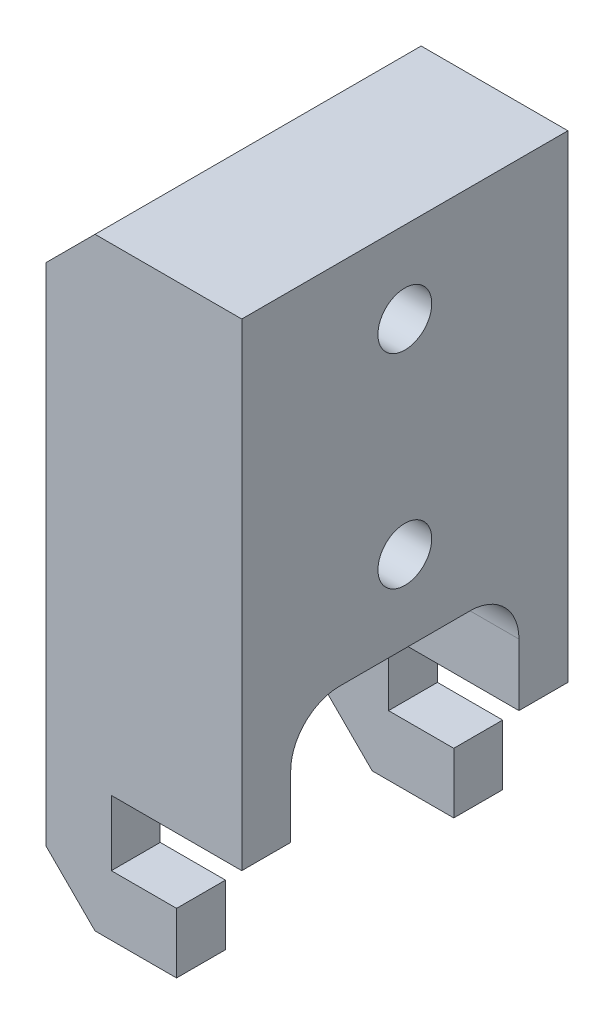
ISO-10303-21;
HEADER;
FILE_DESCRIPTION(('STEP AP214'),'2;1');
FILE_NAME('part.step','',(''),(''),'','','');
FILE_SCHEMA(('AUTOMOTIVE_DESIGN { 1 0 10303 214 1 1 1 1 }'));
ENDSEC;
DATA;
#1=APPLICATION_CONTEXT('core data for automotive mechanical design processes');
#2=APPLICATION_PROTOCOL_DEFINITION('international standard','automotive_design',2000,#1);
#3=PRODUCT_CONTEXT('',#1,'mechanical');
#4=PRODUCT('Part','Part','',(#3));
#5=PRODUCT_RELATED_PRODUCT_CATEGORY('part','',(#4));
#6=PRODUCT_DEFINITION_FORMATION('','',#4);
#7=PRODUCT_DEFINITION_CONTEXT('part definition',#1,'design');
#8=PRODUCT_DEFINITION('design','',#6,#7);
#9=PRODUCT_DEFINITION_SHAPE('','',#8);
#10=(LENGTH_UNIT() NAMED_UNIT(*) SI_UNIT(.MILLI.,.METRE.));
#11=(NAMED_UNIT(*) PLANE_ANGLE_UNIT() SI_UNIT($,.RADIAN.));
#12=(NAMED_UNIT(*) SI_UNIT($,.STERADIAN.) SOLID_ANGLE_UNIT());
#13=UNCERTAINTY_MEASURE_WITH_UNIT(LENGTH_MEASURE(1.E-05),#10,'distance_accuracy_value','');
#14=(GEOMETRIC_REPRESENTATION_CONTEXT(3) GLOBAL_UNCERTAINTY_ASSIGNED_CONTEXT((#13)) GLOBAL_UNIT_ASSIGNED_CONTEXT((#10,
#11,#12)) REPRESENTATION_CONTEXT('',''));
#15=CARTESIAN_POINT('',(0.,0.,0.));
#16=DIRECTION('',(0.,0.,1.));
#17=DIRECTION('',(1.,0.,0.));
#18=AXIS2_PLACEMENT_3D('',#15,#16,#17);
#19=CARTESIAN_POINT('',(12.,-18.5,10.));
#20=DIRECTION('',(0.,1.,0.));
#21=DIRECTION('',(0.,0.,1.));
#22=AXIS2_PLACEMENT_3D('',#19,#20,#21);
#23=PLANE('',#22);
#24=DIRECTION('',(0.,0.,-1.));
#25=VECTOR('',#24,1.);
#26=CARTESIAN_POINT('',(7.999999992,-18.5,-7.));
#27=LINE('',#26,#25);
#28=CARTESIAN_POINT('',(7.999999992,-18.5,-7.));
#29=VERTEX_POINT('',#28);
#30=CARTESIAN_POINT('',(7.999999992,-18.5,-10.));
#31=VERTEX_POINT('',#30);
#32=EDGE_CURVE('E239',#29,#31,#27,.T.);
#33=ORIENTED_EDGE('',*,*,#32,.F.);
#34=DIRECTION('',(1.,0.,0.));
#35=VECTOR('',#34,1.);
#36=CARTESIAN_POINT('',(0.,-18.5,-7.));
#37=LINE('',#36,#35);
#38=CARTESIAN_POINT('',(2.99999999999999,-18.5,-7.));
#39=VERTEX_POINT('',#38);
#40=EDGE_CURVE('E261',#39,#29,#37,.T.);
#41=ORIENTED_EDGE('',*,*,#40,.F.);
#42=DIRECTION('',(0.,0.,-1.));
#43=VECTOR('',#42,1.);
#44=CARTESIAN_POINT('',(2.99999999999999,-18.5,10.));
#45=LINE('',#44,#43);
#46=CARTESIAN_POINT('',(2.99999999999999,-18.5,-10.));
#47=VERTEX_POINT('',#46);
#48=EDGE_CURVE('E324',#39,#47,#45,.T.);
#49=ORIENTED_EDGE('',*,*,#48,.T.);
#50=DIRECTION('',(-1.,0.,0.));
#51=VECTOR('',#50,1.);
#52=CARTESIAN_POINT('',(12.,-18.5,-10.));
#53=LINE('',#52,#51);
#54=EDGE_CURVE('E302',#31,#47,#53,.T.);
#55=ORIENTED_EDGE('',*,*,#54,.F.);
#56=EDGE_LOOP('',(#33,#41,#49,#55));
#57=FACE_BOUND('',#56,.T.);
#58=ADVANCED_FACE('F32',(#57),#23,.F.);
#59=DIRECTION('',(0.,0.,-1.));
#60=VECTOR('',#59,1.);
#61=CARTESIAN_POINT('',(7.999999992,-18.5,10.));
#62=LINE('',#61,#60);
#63=CARTESIAN_POINT('',(7.999999992,-18.5,10.));
#64=VERTEX_POINT('',#63);
#65=CARTESIAN_POINT('',(7.999999992,-18.5,7.));
#66=VERTEX_POINT('',#65);
#67=EDGE_CURVE('E55',#64,#66,#62,.T.);
#68=ORIENTED_EDGE('',*,*,#67,.F.);
#69=DIRECTION('',(-1.,0.,0.));
#70=VECTOR('',#69,1.);
#71=CARTESIAN_POINT('',(12.,-18.5,10.));
#72=LINE('',#71,#70);
#73=CARTESIAN_POINT('',(2.99999999999999,-18.5,10.));
#74=VERTEX_POINT('',#73);
#75=EDGE_CURVE('E304',#64,#74,#72,.T.);
#76=ORIENTED_EDGE('',*,*,#75,.T.);
#77=DIRECTION('',(0.,0.,-1.));
#78=VECTOR('',#77,1.);
#79=CARTESIAN_POINT('',(2.99999999999999,-18.5,10.));
#80=LINE('',#79,#78);
#81=CARTESIAN_POINT('',(2.99999999999999,-18.5,7.));
#82=VERTEX_POINT('',#81);
#83=EDGE_CURVE('E306',#74,#82,#80,.T.);
#84=ORIENTED_EDGE('',*,*,#83,.T.);
#85=DIRECTION('',(-1.,0.,0.));
#86=VECTOR('',#85,1.);
#87=CARTESIAN_POINT('',(12.,-18.5,7.));
#88=LINE('',#87,#86);
#89=EDGE_CURVE('E267',#66,#82,#88,.T.);
#90=ORIENTED_EDGE('',*,*,#89,.F.);
#91=EDGE_LOOP('',(#68,#76,#84,#90));
#92=FACE_BOUND('',#91,.T.);
#93=ADVANCED_FACE('F416',(#92),#23,.F.);
#94=CARTESIAN_POINT('',(12.,18.5,10.));
#95=DIRECTION('',(0.,0.,-1.));
#96=DIRECTION('',(-1.,0.,0.));
#97=AXIS2_PLACEMENT_3D('',#94,#95,#96);
#98=PLANE('',#97);
#99=DIRECTION('',(0.,-1.,0.));
#100=VECTOR('',#99,1.);
#101=CARTESIAN_POINT('',(7.999999992,-10.8,10.));
#102=LINE('',#101,#100);
#103=CARTESIAN_POINT('',(7.999999992,-14.8,10.));
#104=VERTEX_POINT('',#103);
#105=EDGE_CURVE('E254',#104,#64,#102,.T.);
#106=ORIENTED_EDGE('',*,*,#105,.F.);
#107=DIRECTION('',(1.,0.,0.));
#108=VECTOR('',#107,1.);
#109=CARTESIAN_POINT('',(3.999999992,-14.8,10.));
#110=LINE('',#109,#108);
#111=CARTESIAN_POINT('',(3.999999992,-14.8,10.));
#112=VERTEX_POINT('',#111);
#113=EDGE_CURVE('E230',#112,#104,#110,.T.);
#114=ORIENTED_EDGE('',*,*,#113,.F.);
#115=DIRECTION('',(0.,-1.,0.));
#116=VECTOR('',#115,1.);
#117=CARTESIAN_POINT('',(3.999999992,-10.8,10.));
#118=LINE('',#117,#116);
#119=CARTESIAN_POINT('',(3.999999992,-10.8,10.));
#120=VERTEX_POINT('',#119);
#121=EDGE_CURVE('E225',#120,#112,#118,.T.);
#122=ORIENTED_EDGE('',*,*,#121,.F.);
#123=DIRECTION('',(1.,0.,0.));
#124=VECTOR('',#123,1.);
#125=CARTESIAN_POINT('',(7.999999992,-10.8,10.));
#126=LINE('',#125,#124);
#127=CARTESIAN_POINT('',(12.,-10.8,10.));
#128=VERTEX_POINT('',#127);
#129=EDGE_CURVE('E258',#120,#128,#126,.T.);
#130=ORIENTED_EDGE('',*,*,#129,.T.);
#131=DIRECTION('',(0.,-1.,0.));
#132=VECTOR('',#131,1.);
#133=CARTESIAN_POINT('',(12.,18.5,10.));
#134=LINE('',#133,#132);
#135=CARTESIAN_POINT('',(12.,18.5,10.));
#136=VERTEX_POINT('',#135);
#137=EDGE_CURVE('E284',#136,#128,#134,.T.);
#138=ORIENTED_EDGE('',*,*,#137,.F.);
#139=DIRECTION('',(-1.,0.,0.));
#140=VECTOR('',#139,1.);
#141=CARTESIAN_POINT('',(12.,18.5,10.));
#142=LINE('',#141,#140);
#143=CARTESIAN_POINT('',(3.,18.5,10.));
#144=VERTEX_POINT('',#143);
#145=EDGE_CURVE('E292',#136,#144,#142,.T.);
#146=ORIENTED_EDGE('',*,*,#145,.T.);
#147=DIRECTION('',(0.707106781186545,0.70710678118655,0.));
#148=VECTOR('',#147,1.);
#149=CARTESIAN_POINT('',(2.99999999999999,18.5,10.));
#150=LINE('',#149,#148);
#151=CARTESIAN_POINT('',(0.,15.5,10.));
#152=VERTEX_POINT('',#151);
#153=EDGE_CURVE('E319',#144,#152,#150,.F.);
#154=ORIENTED_EDGE('',*,*,#153,.T.);
#155=DIRECTION('',(0.,-1.,0.));
#156=VECTOR('',#155,1.);
#157=CARTESIAN_POINT('',(0.,18.5,10.));
#158=LINE('',#157,#156);
#159=CARTESIAN_POINT('',(0.,-15.5,10.));
#160=VERTEX_POINT('',#159);
#161=EDGE_CURVE('E276',#152,#160,#158,.T.);
#162=ORIENTED_EDGE('',*,*,#161,.T.);
#163=DIRECTION('',(-0.707106781186545,0.70710678118655,0.));
#164=VECTOR('',#163,1.);
#165=CARTESIAN_POINT('',(2.99999999999999,-18.5,10.));
#166=LINE('',#165,#164);
#167=EDGE_CURVE('E321',#160,#74,#166,.F.);
#168=ORIENTED_EDGE('',*,*,#167,.T.);
#169=ORIENTED_EDGE('',*,*,#75,.F.);
#170=EDGE_LOOP('',(#106,#114,#122,#130,#138,#146,#154,#162,#168,#169));
#171=FACE_BOUND('',#170,.T.);
#172=ADVANCED_FACE('F400',(#171),#98,.F.);
#173=CARTESIAN_POINT('',(12.,-18.5,-10.));
#174=DIRECTION('',(0.,0.,1.));
#175=DIRECTION('',(1.,0.,0.));
#176=AXIS2_PLACEMENT_3D('',#173,#174,#175);
#177=PLANE('',#176);
#178=DIRECTION('',(1.,0.,0.));
#179=VECTOR('',#178,1.);
#180=CARTESIAN_POINT('',(7.999999992,-10.8,-10.));
#181=LINE('',#180,#179);
#182=CARTESIAN_POINT('',(3.999999992,-10.8,-10.));
#183=VERTEX_POINT('',#182);
#184=CARTESIAN_POINT('',(12.,-10.8,-10.));
#185=VERTEX_POINT('',#184);
#186=EDGE_CURVE('E244',#183,#185,#181,.T.);
#187=ORIENTED_EDGE('',*,*,#186,.F.);
#188=DIRECTION('',(0.,1.,0.));
#189=VECTOR('',#188,1.);
#190=CARTESIAN_POINT('',(3.999999992,-14.8,-10.));
#191=LINE('',#190,#189);
#192=CARTESIAN_POINT('',(3.999999992,-14.8,-10.));
#193=VERTEX_POINT('',#192);
#194=EDGE_CURVE('E207',#193,#183,#191,.T.);
#195=ORIENTED_EDGE('',*,*,#194,.F.);
#196=DIRECTION('',(1.,0.,0.));
#197=VECTOR('',#196,1.);
#198=CARTESIAN_POINT('',(3.999999992,-14.8,-10.));
#199=LINE('',#198,#197);
#200=CARTESIAN_POINT('',(7.999999992,-14.8,-10.));
#201=VERTEX_POINT('',#200);
#202=EDGE_CURVE('E214',#193,#201,#199,.T.);
#203=ORIENTED_EDGE('',*,*,#202,.T.);
#204=DIRECTION('',(0.,1.,0.));
#205=VECTOR('',#204,1.);
#206=CARTESIAN_POINT('',(7.999999992,-18.5,-10.));
#207=LINE('',#206,#205);
#208=EDGE_CURVE('E241',#31,#201,#207,.T.);
#209=ORIENTED_EDGE('',*,*,#208,.F.);
#210=ORIENTED_EDGE('',*,*,#54,.T.);
#211=DIRECTION('',(0.707106781186545,-0.70710678118655,0.));
#212=VECTOR('',#211,1.);
#213=CARTESIAN_POINT('',(2.99999999999999,-18.5,-10.));
#214=LINE('',#213,#212);
#215=CARTESIAN_POINT('',(0.,-15.5,-10.));
#216=VERTEX_POINT('',#215);
#217=EDGE_CURVE('E329',#47,#216,#214,.F.);
#218=ORIENTED_EDGE('',*,*,#217,.T.);
#219=DIRECTION('',(0.,1.,0.));
#220=VECTOR('',#219,1.);
#221=CARTESIAN_POINT('',(0.,-18.5,-10.));
#222=LINE('',#221,#220);
#223=CARTESIAN_POINT('',(0.,15.5,-10.));
#224=VERTEX_POINT('',#223);
#225=EDGE_CURVE('E288',#216,#224,#222,.T.);
#226=ORIENTED_EDGE('',*,*,#225,.T.);
#227=DIRECTION('',(-0.707106781186545,-0.70710678118655,0.));
#228=VECTOR('',#227,1.);
#229=CARTESIAN_POINT('',(2.99999999999999,18.5,-10.));
#230=LINE('',#229,#228);
#231=CARTESIAN_POINT('',(2.99999999999999,18.5,-10.));
#232=VERTEX_POINT('',#231);
#233=EDGE_CURVE('E327',#224,#232,#230,.F.);
#234=ORIENTED_EDGE('',*,*,#233,.T.);
#235=DIRECTION('',(-1.,0.,0.));
#236=VECTOR('',#235,1.);
#237=CARTESIAN_POINT('',(12.,18.5,-10.));
#238=LINE('',#237,#236);
#239=CARTESIAN_POINT('',(12.,18.5,-10.));
#240=VERTEX_POINT('',#239);
#241=EDGE_CURVE('E299',#240,#232,#238,.T.);
#242=ORIENTED_EDGE('',*,*,#241,.F.);
#243=DIRECTION('',(0.,1.,0.));
#244=VECTOR('',#243,1.);
#245=CARTESIAN_POINT('',(12.,-18.5,-10.));
#246=LINE('',#245,#244);
#247=EDGE_CURVE('E287',#185,#240,#246,.T.);
#248=ORIENTED_EDGE('',*,*,#247,.F.);
#249=EDGE_LOOP('',(#187,#195,#203,#209,#210,#218,#226,#234,#242,#248));
#250=FACE_BOUND('',#249,.T.);
#251=ADVANCED_FACE('F387',(#250),#177,.F.);
#252=CARTESIAN_POINT('',(12.,18.5,-10.));
#253=DIRECTION('',(0.,-1.,0.));
#254=DIRECTION('',(0.,0.,-1.));
#255=AXIS2_PLACEMENT_3D('',#252,#253,#254);
#256=PLANE('',#255);
#257=ORIENTED_EDGE('',*,*,#241,.T.);
#258=DIRECTION('',(0.,0.,1.));
#259=VECTOR('',#258,1.);
#260=CARTESIAN_POINT('',(2.99999999999999,18.5,-10.));
#261=LINE('',#260,#259);
#262=EDGE_CURVE('E333',#232,#144,#261,.T.);
#263=ORIENTED_EDGE('',*,*,#262,.T.);
#264=ORIENTED_EDGE('',*,*,#145,.F.);
#265=DIRECTION('',(0.,0.,1.));
#266=VECTOR('',#265,1.);
#267=CARTESIAN_POINT('',(12.,18.5,-10.));
#268=LINE('',#267,#266);
#269=EDGE_CURVE('E290',#240,#136,#268,.T.);
#270=ORIENTED_EDGE('',*,*,#269,.F.);
#271=EDGE_LOOP('',(#257,#263,#264,#270));
#272=FACE_BOUND('',#271,.T.);
#273=ADVANCED_FACE('F396',(#272),#256,.F.);
#274=CARTESIAN_POINT('',(12.,0.,0.));
#275=DIRECTION('',(1.,0.,0.));
#276=DIRECTION('',(0.,0.,-1.));
#277=AXIS2_PLACEMENT_3D('',#274,#275,#276);
#278=PLANE('',#277);
#279=CARTESIAN_POINT('',(12.,1.,0.));
#280=DIRECTION('',(1.,0.,0.));
#281=DIRECTION('',(0.,0.,-1.));
#282=AXIS2_PLACEMENT_3D('',#279,#280,#281);
#283=CIRCLE('',#282,1.64999999999999);
#284=CARTESIAN_POINT('',(12.,1.,-1.64999999999999));
#285=VERTEX_POINT('',#284);
#286=EDGE_CURVE('E190',#285,#285,#283,.T.);
#287=ORIENTED_EDGE('',*,*,#286,.F.);
#288=EDGE_LOOP('',(#287));
#289=FACE_BOUND('',#288,.T.);
#290=CARTESIAN_POINT('',(12.,13.5,0.));
#291=DIRECTION('',(1.,0.,0.));
#292=DIRECTION('',(0.,0.,-1.));
#293=AXIS2_PLACEMENT_3D('',#290,#291,#292);
#294=CIRCLE('',#293,1.64999999999999);
#295=CARTESIAN_POINT('',(12.,13.5,-1.64999999999999));
#296=VERTEX_POINT('',#295);
#297=EDGE_CURVE('E189',#296,#296,#294,.T.);
#298=ORIENTED_EDGE('',*,*,#297,.F.);
#299=EDGE_LOOP('',(#298));
#300=FACE_BOUND('',#299,.T.);
#301=DIRECTION('',(0.,0.,1.));
#302=VECTOR('',#301,1.);
#303=CARTESIAN_POINT('',(12.,-10.8,-10.));
#304=LINE('',#303,#302);
#305=CARTESIAN_POINT('',(12.,-10.8,-7.));
#306=VERTEX_POINT('',#305);
#307=EDGE_CURVE('E235',#185,#306,#304,.T.);
#308=ORIENTED_EDGE('',*,*,#307,.F.);
#309=ORIENTED_EDGE('',*,*,#247,.T.);
#310=ORIENTED_EDGE('',*,*,#269,.T.);
#311=ORIENTED_EDGE('',*,*,#137,.T.);
#312=DIRECTION('',(0.,0.,1.));
#313=VECTOR('',#312,1.);
#314=CARTESIAN_POINT('',(12.,-10.8,7.));
#315=LINE('',#314,#313);
#316=CARTESIAN_POINT('',(12.,-10.8,7.));
#317=VERTEX_POINT('',#316);
#318=EDGE_CURVE('E249',#317,#128,#315,.T.);
#319=ORIENTED_EDGE('',*,*,#318,.F.);
#320=DIRECTION('',(0.,-1.,0.));
#321=VECTOR('',#320,1.);
#322=CARTESIAN_POINT('',(12.,-4.,7.));
#323=LINE('',#322,#321);
#324=CARTESIAN_POINT('',(12.,-7.,7.));
#325=VERTEX_POINT('',#324);
#326=EDGE_CURVE('E279',#325,#317,#323,.T.);
#327=ORIENTED_EDGE('',*,*,#326,.F.);
#328=CARTESIAN_POINT('',(12.,-7.,4.));
#329=DIRECTION('',(1.,0.,0.));
#330=DIRECTION('',(0.,0.,-1.));
#331=AXIS2_PLACEMENT_3D('',#328,#329,#330);
#332=CIRCLE('',#331,3.);
#333=CARTESIAN_POINT('',(12.,-4.,4.));
#334=VERTEX_POINT('',#333);
#335=EDGE_CURVE('E11',#325,#334,#332,.F.);
#336=ORIENTED_EDGE('',*,*,#335,.T.);
#337=DIRECTION('',(0.,0.,1.));
#338=VECTOR('',#337,1.);
#339=CARTESIAN_POINT('',(12.,-4.,-7.));
#340=LINE('',#339,#338);
#341=CARTESIAN_POINT('',(12.,-4.,-4.));
#342=VERTEX_POINT('',#341);
#343=EDGE_CURVE('E263',#342,#334,#340,.T.);
#344=ORIENTED_EDGE('',*,*,#343,.F.);
#345=CARTESIAN_POINT('',(12.,-7.,-4.));
#346=DIRECTION('',(1.,0.,0.));
#347=DIRECTION('',(0.,0.,-1.));
#348=AXIS2_PLACEMENT_3D('',#345,#346,#347);
#349=CIRCLE('',#348,3.);
#350=CARTESIAN_POINT('',(12.,-7.,-7.));
#351=VERTEX_POINT('',#350);
#352=EDGE_CURVE('E346',#342,#351,#349,.F.);
#353=ORIENTED_EDGE('',*,*,#352,.T.);
#354=DIRECTION('',(0.,-1.,0.));
#355=VECTOR('',#354,1.);
#356=CARTESIAN_POINT('',(12.,-4.,-7.));
#357=LINE('',#356,#355);
#358=EDGE_CURVE('E270',#351,#306,#357,.T.);
#359=ORIENTED_EDGE('',*,*,#358,.T.);
#360=EDGE_LOOP('',(#308,#309,#310,#311,#319,#327,#336,#344,#353,#359));
#361=FACE_BOUND('',#360,.T.);
#362=ADVANCED_FACE('F366',(#289,#300,#361),#278,.T.);
#363=CARTESIAN_POINT('',(0.,0.,0.));
#364=DIRECTION('',(1.,0.,0.));
#365=DIRECTION('',(0.,0.,-1.));
#366=AXIS2_PLACEMENT_3D('',#363,#364,#365);
#367=PLANE('',#366);
#368=DIRECTION('',(0.,0.,-1.));
#369=VECTOR('',#368,1.);
#370=CARTESIAN_POINT('',(0.,-4.,7.));
#371=LINE('',#370,#369);
#372=CARTESIAN_POINT('',(0.,-4.,4.));
#373=VERTEX_POINT('',#372);
#374=CARTESIAN_POINT('',(0.,-4.,-4.));
#375=VERTEX_POINT('',#374);
#376=EDGE_CURVE('E266',#373,#375,#371,.T.);
#377=ORIENTED_EDGE('',*,*,#376,.F.);
#378=CARTESIAN_POINT('',(0.,-7.,4.));
#379=DIRECTION('',(1.,0.,0.));
#380=DIRECTION('',(0.,0.,-1.));
#381=AXIS2_PLACEMENT_3D('',#378,#379,#380);
#382=CIRCLE('',#381,3.);
#383=CARTESIAN_POINT('',(0.,-7.,7.));
#384=VERTEX_POINT('',#383);
#385=EDGE_CURVE('E40',#373,#384,#382,.T.);
#386=ORIENTED_EDGE('',*,*,#385,.T.);
#387=DIRECTION('',(0.,-1.,0.));
#388=VECTOR('',#387,1.);
#389=CARTESIAN_POINT('',(0.,-4.,7.));
#390=LINE('',#389,#388);
#391=CARTESIAN_POINT('',(0.,-15.5,7.));
#392=VERTEX_POINT('',#391);
#393=EDGE_CURVE('E277',#384,#392,#390,.T.);
#394=ORIENTED_EDGE('',*,*,#393,.T.);
#395=DIRECTION('',(0.,0.,1.));
#396=VECTOR('',#395,1.);
#397=CARTESIAN_POINT('',(0.,-15.5,0.));
#398=LINE('',#397,#396);
#399=EDGE_CURVE('E317',#392,#160,#398,.T.);
#400=ORIENTED_EDGE('',*,*,#399,.T.);
#401=ORIENTED_EDGE('',*,*,#161,.F.);
#402=DIRECTION('',(0.,0.,-1.));
#403=VECTOR('',#402,1.);
#404=CARTESIAN_POINT('',(0.,15.5,0.));
#405=LINE('',#404,#403);
#406=EDGE_CURVE('E312',#152,#224,#405,.T.);
#407=ORIENTED_EDGE('',*,*,#406,.T.);
#408=ORIENTED_EDGE('',*,*,#225,.F.);
#409=DIRECTION('',(0.,0.,1.));
#410=VECTOR('',#409,1.);
#411=CARTESIAN_POINT('',(0.,-15.5,0.));
#412=LINE('',#411,#410);
#413=CARTESIAN_POINT('',(0.,-15.5,-7.));
#414=VERTEX_POINT('',#413);
#415=EDGE_CURVE('E314',#216,#414,#412,.T.);
#416=ORIENTED_EDGE('',*,*,#415,.T.);
#417=DIRECTION('',(0.,-1.,0.));
#418=VECTOR('',#417,1.);
#419=CARTESIAN_POINT('',(0.,-4.,-7.));
#420=LINE('',#419,#418);
#421=CARTESIAN_POINT('',(0.,-7.,-7.));
#422=VERTEX_POINT('',#421);
#423=EDGE_CURVE('E274',#422,#414,#420,.T.);
#424=ORIENTED_EDGE('',*,*,#423,.F.);
#425=CARTESIAN_POINT('',(0.,-7.,-4.));
#426=DIRECTION('',(1.,0.,0.));
#427=DIRECTION('',(0.,0.,-1.));
#428=AXIS2_PLACEMENT_3D('',#425,#426,#427);
#429=CIRCLE('',#428,3.);
#430=EDGE_CURVE('E348',#422,#375,#429,.T.);
#431=ORIENTED_EDGE('',*,*,#430,.T.);
#432=EDGE_LOOP('',(#377,#386,#394,#400,#401,#407,#408,#416,#424,#431));
#433=FACE_BOUND('',#432,.T.);
#434=ADVANCED_FACE('F352',(#433),#367,.F.);
#435=CARTESIAN_POINT('',(0.,-4.,-7.));
#436=DIRECTION('',(0.,0.,-1.));
#437=DIRECTION('',(-1.,0.,0.));
#438=AXIS2_PLACEMENT_3D('',#435,#436,#437);
#439=PLANE('',#438);
#440=DIRECTION('',(0.,-1.,0.));
#441=VECTOR('',#440,1.);
#442=CARTESIAN_POINT('',(3.999999992,-10.8,-7.));
#443=LINE('',#442,#441);
#444=CARTESIAN_POINT('',(3.999999992,-10.8,-7.));
#445=VERTEX_POINT('',#444);
#446=CARTESIAN_POINT('',(3.999999992,-14.8,-7.));
#447=VERTEX_POINT('',#446);
#448=EDGE_CURVE('E201',#445,#447,#443,.T.);
#449=ORIENTED_EDGE('',*,*,#448,.F.);
#450=DIRECTION('',(1.,0.,0.));
#451=VECTOR('',#450,1.);
#452=CARTESIAN_POINT('',(7.999999992,-10.8,-7.));
#453=LINE('',#452,#451);
#454=EDGE_CURVE('E246',#445,#306,#453,.T.);
#455=ORIENTED_EDGE('',*,*,#454,.T.);
#456=ORIENTED_EDGE('',*,*,#358,.F.);
#457=DIRECTION('',(1.,0.,0.));
#458=VECTOR('',#457,1.);
#459=CARTESIAN_POINT('',(0.,-7.,-7.));
#460=LINE('',#459,#458);
#461=EDGE_CURVE('E342',#351,#422,#460,.F.);
#462=ORIENTED_EDGE('',*,*,#461,.T.);
#463=ORIENTED_EDGE('',*,*,#423,.T.);
#464=DIRECTION('',(-0.707106781186545,0.70710678118655,0.));
#465=VECTOR('',#464,1.);
#466=CARTESIAN_POINT('',(2.99999999999999,-18.5,-7.));
#467=LINE('',#466,#465);
#468=EDGE_CURVE('E331',#414,#39,#467,.F.);
#469=ORIENTED_EDGE('',*,*,#468,.T.);
#470=ORIENTED_EDGE('',*,*,#40,.T.);
#471=DIRECTION('',(0.,-1.,0.));
#472=VECTOR('',#471,1.);
#473=CARTESIAN_POINT('',(7.999999992,-10.8,-7.));
#474=LINE('',#473,#472);
#475=CARTESIAN_POINT('',(7.999999992,-14.8,-7.));
#476=VERTEX_POINT('',#475);
#477=EDGE_CURVE('E237',#476,#29,#474,.T.);
#478=ORIENTED_EDGE('',*,*,#477,.F.);
#479=DIRECTION('',(1.,0.,0.));
#480=VECTOR('',#479,1.);
#481=CARTESIAN_POINT('',(3.999999992,-14.8,-7.));
#482=LINE('',#481,#480);
#483=EDGE_CURVE('E47',#447,#476,#482,.T.);
#484=ORIENTED_EDGE('',*,*,#483,.F.);
#485=EDGE_LOOP('',(#449,#455,#456,#462,#463,#469,#470,#478,#484));
#486=FACE_BOUND('',#485,.T.);
#487=ADVANCED_FACE('F378',(#486),#439,.F.);
#488=CARTESIAN_POINT('',(12.,-4.,7.));
#489=DIRECTION('',(0.,0.,1.));
#490=DIRECTION('',(1.,0.,0.));
#491=AXIS2_PLACEMENT_3D('',#488,#489,#490);
#492=PLANE('',#491);
#493=DIRECTION('',(0.,1.,0.));
#494=VECTOR('',#493,1.);
#495=CARTESIAN_POINT('',(3.999999992,-14.8,7.));
#496=LINE('',#495,#494);
#497=CARTESIAN_POINT('',(3.999999992,-14.8,7.));
#498=VERTEX_POINT('',#497);
#499=CARTESIAN_POINT('',(3.999999992,-10.8,7.));
#500=VERTEX_POINT('',#499);
#501=EDGE_CURVE('E219',#498,#500,#496,.T.);
#502=ORIENTED_EDGE('',*,*,#501,.F.);
#503=DIRECTION('',(1.,0.,0.));
#504=VECTOR('',#503,1.);
#505=CARTESIAN_POINT('',(3.999999992,-14.8,7.));
#506=LINE('',#505,#504);
#507=CARTESIAN_POINT('',(7.999999992,-14.8,7.));
#508=VERTEX_POINT('',#507);
#509=EDGE_CURVE('E232',#498,#508,#506,.T.);
#510=ORIENTED_EDGE('',*,*,#509,.T.);
#511=DIRECTION('',(0.,1.,0.));
#512=VECTOR('',#511,1.);
#513=CARTESIAN_POINT('',(7.999999992,-18.5,7.));
#514=LINE('',#513,#512);
#515=EDGE_CURVE('E252',#66,#508,#514,.T.);
#516=ORIENTED_EDGE('',*,*,#515,.F.);
#517=ORIENTED_EDGE('',*,*,#89,.T.);
#518=DIRECTION('',(0.707106781186545,-0.70710678118655,0.));
#519=VECTOR('',#518,1.);
#520=CARTESIAN_POINT('',(2.99999999999999,-18.5,7.));
#521=LINE('',#520,#519);
#522=EDGE_CURVE('E309',#82,#392,#521,.F.);
#523=ORIENTED_EDGE('',*,*,#522,.T.);
#524=ORIENTED_EDGE('',*,*,#393,.F.);
#525=DIRECTION('',(-1.,0.,0.));
#526=VECTOR('',#525,1.);
#527=CARTESIAN_POINT('',(12.,-7.,7.));
#528=LINE('',#527,#526);
#529=EDGE_CURVE('E344',#384,#325,#528,.F.);
#530=ORIENTED_EDGE('',*,*,#529,.T.);
#531=ORIENTED_EDGE('',*,*,#326,.T.);
#532=DIRECTION('',(1.,0.,0.));
#533=VECTOR('',#532,1.);
#534=CARTESIAN_POINT('',(7.999999992,-10.8,7.));
#535=LINE('',#534,#533);
#536=EDGE_CURVE('E256',#500,#317,#535,.T.);
#537=ORIENTED_EDGE('',*,*,#536,.F.);
#538=EDGE_LOOP('',(#502,#510,#516,#517,#523,#524,#530,#531,#537));
#539=FACE_BOUND('',#538,.T.);
#540=ADVANCED_FACE('F358',(#539),#492,.F.);
#541=CARTESIAN_POINT('',(0.,-4.,0.));
#542=DIRECTION('',(0.,-1.,0.));
#543=DIRECTION('',(0.,0.,-1.));
#544=AXIS2_PLACEMENT_3D('',#541,#542,#543);
#545=PLANE('',#544);
#546=ORIENTED_EDGE('',*,*,#376,.T.);
#547=DIRECTION('',(1.,0.,0.));
#548=VECTOR('',#547,1.);
#549=CARTESIAN_POINT('',(0.,-4.,-4.));
#550=LINE('',#549,#548);
#551=EDGE_CURVE('E339',#375,#342,#550,.T.);
#552=ORIENTED_EDGE('',*,*,#551,.T.);
#553=ORIENTED_EDGE('',*,*,#343,.T.);
#554=DIRECTION('',(-1.,0.,0.));
#555=VECTOR('',#554,1.);
#556=CARTESIAN_POINT('',(0.,-4.,4.));
#557=LINE('',#556,#555);
#558=EDGE_CURVE('E336',#334,#373,#557,.T.);
#559=ORIENTED_EDGE('',*,*,#558,.T.);
#560=EDGE_LOOP('',(#546,#552,#553,#559));
#561=FACE_BOUND('',#560,.T.);
#562=ADVANCED_FACE('F369',(#561),#545,.T.);
#563=CARTESIAN_POINT('',(2.99999999999999,-18.5,10.));
#564=DIRECTION('',(0.70710678118655,0.707106781186545,0.));
#565=DIRECTION('',(0.,0.,-1.));
#566=AXIS2_PLACEMENT_3D('',#563,#564,#565);
#567=PLANE('',#566);
#568=ORIENTED_EDGE('',*,*,#167,.F.);
#569=ORIENTED_EDGE('',*,*,#399,.F.);
#570=ORIENTED_EDGE('',*,*,#522,.F.);
#571=ORIENTED_EDGE('',*,*,#83,.F.);
#572=EDGE_LOOP('',(#568,#569,#570,#571));
#573=FACE_BOUND('',#572,.T.);
#574=ADVANCED_FACE('F420',(#573),#567,.F.);
#575=CARTESIAN_POINT('',(2.99999999999999,-18.5,10.));
#576=DIRECTION('',(0.70710678118655,0.707106781186545,0.));
#577=DIRECTION('',(0.,0.,-1.));
#578=AXIS2_PLACEMENT_3D('',#575,#576,#577);
#579=PLANE('',#578);
#580=ORIENTED_EDGE('',*,*,#468,.F.);
#581=ORIENTED_EDGE('',*,*,#415,.F.);
#582=ORIENTED_EDGE('',*,*,#217,.F.);
#583=ORIENTED_EDGE('',*,*,#48,.F.);
#584=EDGE_LOOP('',(#580,#581,#582,#583));
#585=FACE_BOUND('',#584,.T.);
#586=ADVANCED_FACE('F432',(#585),#579,.F.);
#587=CARTESIAN_POINT('',(2.99999999999999,18.5,-10.));
#588=DIRECTION('',(0.70710678118655,-0.707106781186545,0.));
#589=DIRECTION('',(0.,0.,1.));
#590=AXIS2_PLACEMENT_3D('',#587,#588,#589);
#591=PLANE('',#590);
#592=ORIENTED_EDGE('',*,*,#233,.F.);
#593=ORIENTED_EDGE('',*,*,#406,.F.);
#594=ORIENTED_EDGE('',*,*,#153,.F.);
#595=ORIENTED_EDGE('',*,*,#262,.F.);
#596=EDGE_LOOP('',(#592,#593,#594,#595));
#597=FACE_BOUND('',#596,.T.);
#598=ADVANCED_FACE('F424',(#597),#591,.F.);
#599=CARTESIAN_POINT('',(0.,-7.,-4.));
#600=DIRECTION('',(1.,0.,0.));
#601=DIRECTION('',(0.,0.,-1.));
#602=AXIS2_PLACEMENT_3D('',#599,#600,#601);
#603=CYLINDRICAL_SURFACE('',#602,3.);
#604=ORIENTED_EDGE('',*,*,#430,.F.);
#605=ORIENTED_EDGE('',*,*,#461,.F.);
#606=ORIENTED_EDGE('',*,*,#352,.F.);
#607=ORIENTED_EDGE('',*,*,#551,.F.);
#608=EDGE_LOOP('',(#604,#605,#606,#607));
#609=FACE_BOUND('',#608,.T.);
#610=ADVANCED_FACE('F373',(#609),#603,.F.);
#611=CARTESIAN_POINT('',(0.,-7.,4.));
#612=DIRECTION('',(-1.,0.,0.));
#613=DIRECTION('',(0.,0.,1.));
#614=AXIS2_PLACEMENT_3D('',#611,#612,#613);
#615=CYLINDRICAL_SURFACE('',#614,3.);
#616=ORIENTED_EDGE('',*,*,#335,.F.);
#617=ORIENTED_EDGE('',*,*,#529,.F.);
#618=ORIENTED_EDGE('',*,*,#385,.F.);
#619=ORIENTED_EDGE('',*,*,#558,.F.);
#620=EDGE_LOOP('',(#616,#617,#618,#619));
#621=FACE_BOUND('',#620,.T.);
#622=ADVANCED_FACE('F34',(#621),#615,.F.);
#623=CARTESIAN_POINT('',(7.999999992,-10.8,7.));
#624=DIRECTION('',(0.,1.,0.));
#625=DIRECTION('',(0.,0.,1.));
#626=AXIS2_PLACEMENT_3D('',#623,#624,#625);
#627=PLANE('',#626);
#628=ORIENTED_EDGE('',*,*,#318,.T.);
#629=ORIENTED_EDGE('',*,*,#129,.F.);
#630=DIRECTION('',(0.,0.,1.));
#631=VECTOR('',#630,1.);
#632=CARTESIAN_POINT('',(3.999999992,-10.8,7.));
#633=LINE('',#632,#631);
#634=EDGE_CURVE('E222',#500,#120,#633,.T.);
#635=ORIENTED_EDGE('',*,*,#634,.F.);
#636=ORIENTED_EDGE('',*,*,#536,.T.);
#637=EDGE_LOOP('',(#628,#629,#635,#636));
#638=FACE_BOUND('',#637,.T.);
#639=ADVANCED_FACE('F404',(#638),#627,.F.);
#640=CARTESIAN_POINT('',(7.999999992,0.,0.));
#641=DIRECTION('',(1.,0.,0.));
#642=DIRECTION('',(0.,0.,-1.));
#643=AXIS2_PLACEMENT_3D('',#640,#641,#642);
#644=PLANE('',#643);
#645=DIRECTION('',(0.,0.,-1.));
#646=VECTOR('',#645,1.);
#647=CARTESIAN_POINT('',(7.999999992,-14.8,10.));
#648=LINE('',#647,#646);
#649=EDGE_CURVE('E217',#104,#508,#648,.T.);
#650=ORIENTED_EDGE('',*,*,#649,.F.);
#651=ORIENTED_EDGE('',*,*,#105,.T.);
#652=ORIENTED_EDGE('',*,*,#67,.T.);
#653=ORIENTED_EDGE('',*,*,#515,.T.);
#654=EDGE_LOOP('',(#650,#651,#652,#653));
#655=FACE_BOUND('',#654,.T.);
#656=ADVANCED_FACE('F413',(#655),#644,.T.);
#657=CARTESIAN_POINT('',(7.999999992,-10.8,-10.));
#658=DIRECTION('',(0.,1.,0.));
#659=DIRECTION('',(0.,0.,1.));
#660=AXIS2_PLACEMENT_3D('',#657,#658,#659);
#661=PLANE('',#660);
#662=ORIENTED_EDGE('',*,*,#307,.T.);
#663=ORIENTED_EDGE('',*,*,#454,.F.);
#664=DIRECTION('',(0.,0.,1.));
#665=VECTOR('',#664,1.);
#666=CARTESIAN_POINT('',(3.999999992,-10.8,-10.));
#667=LINE('',#666,#665);
#668=EDGE_CURVE('E210',#183,#445,#667,.T.);
#669=ORIENTED_EDGE('',*,*,#668,.F.);
#670=ORIENTED_EDGE('',*,*,#186,.T.);
#671=EDGE_LOOP('',(#662,#663,#669,#670));
#672=FACE_BOUND('',#671,.T.);
#673=ADVANCED_FACE('F382',(#672),#661,.F.);
#674=CARTESIAN_POINT('',(7.999999992,0.,0.));
#675=DIRECTION('',(1.,0.,0.));
#676=DIRECTION('',(0.,0.,-1.));
#677=AXIS2_PLACEMENT_3D('',#674,#675,#676);
#678=PLANE('',#677);
#679=DIRECTION('',(0.,0.,-1.));
#680=VECTOR('',#679,1.);
#681=CARTESIAN_POINT('',(7.999999992,-14.8,-7.));
#682=LINE('',#681,#680);
#683=EDGE_CURVE('E200',#476,#201,#682,.T.);
#684=ORIENTED_EDGE('',*,*,#683,.F.);
#685=ORIENTED_EDGE('',*,*,#477,.T.);
#686=ORIENTED_EDGE('',*,*,#32,.T.);
#687=ORIENTED_EDGE('',*,*,#208,.T.);
#688=EDGE_LOOP('',(#684,#685,#686,#687));
#689=FACE_BOUND('',#688,.T.);
#690=ADVANCED_FACE('F438',(#689),#678,.T.);
#691=CARTESIAN_POINT('',(3.999999992,-14.8,10.));
#692=DIRECTION('',(0.,-1.,0.));
#693=DIRECTION('',(0.,0.,-1.));
#694=AXIS2_PLACEMENT_3D('',#691,#692,#693);
#695=PLANE('',#694);
#696=ORIENTED_EDGE('',*,*,#649,.T.);
#697=ORIENTED_EDGE('',*,*,#509,.F.);
#698=DIRECTION('',(0.,0.,-1.));
#699=VECTOR('',#698,1.);
#700=CARTESIAN_POINT('',(3.999999992,-14.8,10.));
#701=LINE('',#700,#699);
#702=EDGE_CURVE('E227',#112,#498,#701,.T.);
#703=ORIENTED_EDGE('',*,*,#702,.F.);
#704=ORIENTED_EDGE('',*,*,#113,.T.);
#705=EDGE_LOOP('',(#696,#697,#703,#704));
#706=FACE_BOUND('',#705,.T.);
#707=ADVANCED_FACE('F410',(#706),#695,.F.);
#708=CARTESIAN_POINT('',(3.999999992,0.,0.));
#709=DIRECTION('',(1.,0.,0.));
#710=DIRECTION('',(0.,0.,-1.));
#711=AXIS2_PLACEMENT_3D('',#708,#709,#710);
#712=PLANE('',#711);
#713=ORIENTED_EDGE('',*,*,#501,.T.);
#714=ORIENTED_EDGE('',*,*,#634,.T.);
#715=ORIENTED_EDGE('',*,*,#121,.T.);
#716=ORIENTED_EDGE('',*,*,#702,.T.);
#717=EDGE_LOOP('',(#713,#714,#715,#716));
#718=FACE_BOUND('',#717,.T.);
#719=ADVANCED_FACE('F406',(#718),#712,.T.);
#720=CARTESIAN_POINT('',(3.999999992,-14.8,-7.));
#721=DIRECTION('',(0.,-1.,0.));
#722=DIRECTION('',(0.,0.,-1.));
#723=AXIS2_PLACEMENT_3D('',#720,#721,#722);
#724=PLANE('',#723);
#725=ORIENTED_EDGE('',*,*,#683,.T.);
#726=ORIENTED_EDGE('',*,*,#202,.F.);
#727=DIRECTION('',(0.,0.,-1.));
#728=VECTOR('',#727,1.);
#729=CARTESIAN_POINT('',(3.999999992,-14.8,-7.));
#730=LINE('',#729,#728);
#731=EDGE_CURVE('E204',#447,#193,#730,.T.);
#732=ORIENTED_EDGE('',*,*,#731,.F.);
#733=ORIENTED_EDGE('',*,*,#483,.T.);
#734=EDGE_LOOP('',(#725,#726,#732,#733));
#735=FACE_BOUND('',#734,.T.);
#736=ADVANCED_FACE('F439',(#735),#724,.F.);
#737=CARTESIAN_POINT('',(3.999999992,0.,0.));
#738=DIRECTION('',(1.,0.,0.));
#739=DIRECTION('',(0.,0.,-1.));
#740=AXIS2_PLACEMENT_3D('',#737,#738,#739);
#741=PLANE('',#740);
#742=ORIENTED_EDGE('',*,*,#448,.T.);
#743=ORIENTED_EDGE('',*,*,#731,.T.);
#744=ORIENTED_EDGE('',*,*,#194,.T.);
#745=ORIENTED_EDGE('',*,*,#668,.T.);
#746=EDGE_LOOP('',(#742,#743,#744,#745));
#747=FACE_BOUND('',#746,.T.);
#748=ADVANCED_FACE('F384',(#747),#741,.T.);
#749=CARTESIAN_POINT('',(4.00000000000001,13.5,0.));
#750=DIRECTION('',(1.,0.,0.));
#751=DIRECTION('',(0.,0.,-1.));
#752=AXIS2_PLACEMENT_3D('',#749,#750,#751);
#753=CONICAL_SURFACE('',#752,1.64999999999999,1.02974425885275);
#754=CARTESIAN_POINT('',(3.00857997900001,13.5,0.));
#755=VERTEX_POINT('',#754);
#756=VERTEX_LOOP('',#755);
#757=FACE_BOUND('',#756,.T.);
#758=CARTESIAN_POINT('',(4.00000000000001,13.5,0.));
#759=DIRECTION('',(1.,0.,0.));
#760=DIRECTION('',(0.,0.,-1.));
#761=AXIS2_PLACEMENT_3D('',#758,#759,#760);
#762=CIRCLE('',#761,1.64999999999999);
#763=CARTESIAN_POINT('',(4.00000000000001,13.5,-1.64999999999999));
#764=VERTEX_POINT('',#763);
#765=EDGE_CURVE('E193',#764,#764,#762,.T.);
#766=ORIENTED_EDGE('',*,*,#765,.T.);
#767=EDGE_LOOP('',(#766));
#768=FACE_BOUND('',#767,.T.);
#769=ADVANCED_FACE('F446',(#757,#768),#753,.F.);
#770=CARTESIAN_POINT('',(12.,13.5,0.));
#771=DIRECTION('',(1.,0.,0.));
#772=DIRECTION('',(0.,0.,-1.));
#773=AXIS2_PLACEMENT_3D('',#770,#771,#772);
#774=CYLINDRICAL_SURFACE('',#773,1.64999999999999);
#775=ORIENTED_EDGE('',*,*,#765,.F.);
#776=EDGE_LOOP('',(#775));
#777=FACE_BOUND('',#776,.T.);
#778=ORIENTED_EDGE('',*,*,#297,.T.);
#779=EDGE_LOOP('',(#778));
#780=FACE_BOUND('',#779,.T.);
#781=ADVANCED_FACE('F183',(#777,#780),#774,.F.);
#782=CARTESIAN_POINT('',(4.00000000000001,1.,0.));
#783=DIRECTION('',(1.,0.,0.));
#784=DIRECTION('',(0.,0.,-1.));
#785=AXIS2_PLACEMENT_3D('',#782,#783,#784);
#786=CONICAL_SURFACE('',#785,1.64999999999999,1.02974425885275);
#787=CARTESIAN_POINT('',(3.00857997900001,0.999999999999999,0.));
#788=VERTEX_POINT('',#787);
#789=VERTEX_LOOP('',#788);
#790=FACE_BOUND('',#789,.T.);
#791=CARTESIAN_POINT('',(4.00000000000001,1.,0.));
#792=DIRECTION('',(1.,0.,0.));
#793=DIRECTION('',(0.,0.,-1.));
#794=AXIS2_PLACEMENT_3D('',#791,#792,#793);
#795=CIRCLE('',#794,1.64999999999999);
#796=CARTESIAN_POINT('',(4.00000000000001,1.,-1.64999999999999));
#797=VERTEX_POINT('',#796);
#798=EDGE_CURVE('E187',#797,#797,#795,.T.);
#799=ORIENTED_EDGE('',*,*,#798,.T.);
#800=EDGE_LOOP('',(#799));
#801=FACE_BOUND('',#800,.T.);
#802=ADVANCED_FACE('F179',(#790,#801),#786,.F.);
#803=CARTESIAN_POINT('',(12.,1.,0.));
#804=DIRECTION('',(1.,0.,0.));
#805=DIRECTION('',(0.,0.,-1.));
#806=AXIS2_PLACEMENT_3D('',#803,#804,#805);
#807=CYLINDRICAL_SURFACE('',#806,1.64999999999999);
#808=ORIENTED_EDGE('',*,*,#798,.F.);
#809=EDGE_LOOP('',(#808));
#810=FACE_BOUND('',#809,.T.);
#811=ORIENTED_EDGE('',*,*,#286,.T.);
#812=EDGE_LOOP('',(#811));
#813=FACE_BOUND('',#812,.T.);
#814=ADVANCED_FACE('F182',(#810,#813),#807,.F.);
#815=CLOSED_SHELL('',(#58,#93,#172,#251,#273,#362,#434,#487,#540,#562,#574,#586,#598,#610,#622,
#639,#656,#673,#690,#707,#719,#736,#748,#769,#781,#802,#814));
#816=MANIFOLD_SOLID_BREP('B2',#815);
#817=ADVANCED_BREP_SHAPE_REPRESENTATION('',(#18,#816),#14);
#818=SHAPE_DEFINITION_REPRESENTATION(#9,#817);
ENDSEC;
END-ISO-10303-21;
